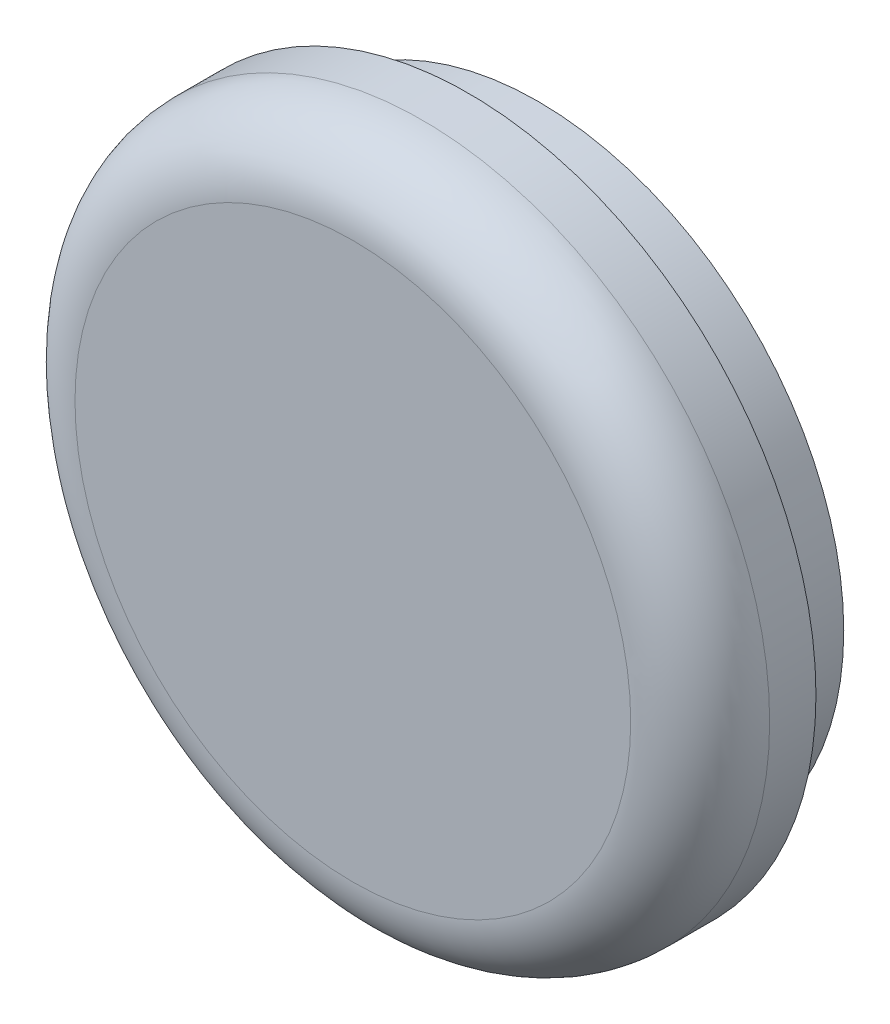
ISO-10303-21;
HEADER;
FILE_DESCRIPTION(('STEP AP214'),'2;1');
FILE_NAME('part.step','',(''),(''),'','','');
FILE_SCHEMA(('AUTOMOTIVE_DESIGN { 1 0 10303 214 1 1 1 1 }'));
ENDSEC;
DATA;
#1=APPLICATION_CONTEXT('core data for automotive mechanical design processes');
#2=APPLICATION_PROTOCOL_DEFINITION('international standard','automotive_design',2000,#1);
#3=PRODUCT_CONTEXT('',#1,'mechanical');
#4=PRODUCT('Part','Part','',(#3));
#5=PRODUCT_RELATED_PRODUCT_CATEGORY('part','',(#4));
#6=PRODUCT_DEFINITION_FORMATION('','',#4);
#7=PRODUCT_DEFINITION_CONTEXT('part definition',#1,'design');
#8=PRODUCT_DEFINITION('design','',#6,#7);
#9=PRODUCT_DEFINITION_SHAPE('','',#8);
#10=(LENGTH_UNIT() NAMED_UNIT(*) SI_UNIT(.MILLI.,.METRE.));
#11=(NAMED_UNIT(*) PLANE_ANGLE_UNIT() SI_UNIT($,.RADIAN.));
#12=(NAMED_UNIT(*) SI_UNIT($,.STERADIAN.) SOLID_ANGLE_UNIT());
#13=UNCERTAINTY_MEASURE_WITH_UNIT(LENGTH_MEASURE(1.E-05),#10,'distance_accuracy_value','');
#14=(GEOMETRIC_REPRESENTATION_CONTEXT(3) GLOBAL_UNCERTAINTY_ASSIGNED_CONTEXT((#13)) GLOBAL_UNIT_ASSIGNED_CONTEXT((#10,
#11,#12)) REPRESENTATION_CONTEXT('',''));
#15=CARTESIAN_POINT('',(0.,0.,0.));
#16=DIRECTION('',(0.,0.,1.));
#17=DIRECTION('',(1.,0.,0.));
#18=AXIS2_PLACEMENT_3D('',#15,#16,#17);
#19=CARTESIAN_POINT('',(0.,0.,3.5));
#20=DIRECTION('',(0.,0.,-1.));
#21=DIRECTION('',(-1.,0.,0.));
#22=AXIS2_PLACEMENT_3D('',#19,#20,#21);
#23=PLANE('',#22);
#24=CARTESIAN_POINT('',(0.,0.,3.5));
#25=DIRECTION('',(0.,0.,-1.));
#26=DIRECTION('',(-1.,0.,0.));
#27=AXIS2_PLACEMENT_3D('',#24,#25,#26);
#28=CIRCLE('',#27,9.);
#29=CARTESIAN_POINT('',(-9.,0.,3.5));
#30=VERTEX_POINT('',#29);
#31=EDGE_CURVE('E51',#30,#30,#28,.T.);
#32=ORIENTED_EDGE('',*,*,#31,.T.);
#33=EDGE_LOOP('',(#32));
#34=FACE_BOUND('',#33,.T.);
#35=ADVANCED_FACE('F39',(#34),#23,.T.);
#36=CARTESIAN_POINT('',(0.,0.,0.5));
#37=DIRECTION('',(0.,0.,-1.));
#38=DIRECTION('',(-1.,0.,0.));
#39=AXIS2_PLACEMENT_3D('',#36,#37,#38);
#40=TOROIDAL_SURFACE('',#39,9.,3.);
#41=CARTESIAN_POINT('',(0.,0.,0.5));
#42=DIRECTION('',(0.,0.,-1.));
#43=DIRECTION('',(-1.,0.,0.));
#44=AXIS2_PLACEMENT_3D('',#41,#42,#43);
#45=CIRCLE('',#44,12.);
#46=CARTESIAN_POINT('',(-12.,0.,0.5));
#47=VERTEX_POINT('',#46);
#48=EDGE_CURVE('E43',#47,#47,#45,.F.);
#49=ORIENTED_EDGE('',*,*,#48,.F.);
#50=EDGE_LOOP('',(#49));
#51=FACE_BOUND('',#50,.T.);
#52=ORIENTED_EDGE('',*,*,#31,.F.);
#53=EDGE_LOOP('',(#52));
#54=FACE_BOUND('',#53,.T.);
#55=ADVANCED_FACE('F41',(#51,#54),#40,.F.);
#56=CARTESIAN_POINT('',(0.,0.,3.5));
#57=DIRECTION('',(0.,0.,-1.));
#58=DIRECTION('',(-1.,0.,0.));
#59=AXIS2_PLACEMENT_3D('',#56,#57,#58);
#60=CYLINDRICAL_SURFACE('',#59,12.);
#61=ORIENTED_EDGE('',*,*,#48,.T.);
#62=EDGE_LOOP('',(#61));
#63=FACE_BOUND('',#62,.T.);
#64=CARTESIAN_POINT('',(0.,0.,-3.));
#65=DIRECTION('',(0.,0.,-1.));
#66=DIRECTION('',(-1.,0.,0.));
#67=AXIS2_PLACEMENT_3D('',#64,#65,#66);
#68=CIRCLE('',#67,12.);
#69=CARTESIAN_POINT('',(-12.,0.,-3.));
#70=VERTEX_POINT('',#69);
#71=EDGE_CURVE('E83',#70,#70,#68,.T.);
#72=ORIENTED_EDGE('',*,*,#71,.T.);
#73=EDGE_LOOP('',(#72));
#74=FACE_BOUND('',#73,.T.);
#75=ADVANCED_FACE('F70',(#63,#74),#60,.F.);
#76=CARTESIAN_POINT('',(0.,0.,5.));
#77=DIRECTION('',(0.,0.,-1.));
#78=DIRECTION('',(-1.,0.,0.));
#79=AXIS2_PLACEMENT_3D('',#76,#77,#78);
#80=CYLINDRICAL_SURFACE('',#79,15.);
#81=CARTESIAN_POINT('',(0.,0.,2.));
#82=DIRECTION('',(0.,0.,1.));
#83=DIRECTION('',(1.,0.,0.));
#84=AXIS2_PLACEMENT_3D('',#81,#82,#83);
#85=CIRCLE('',#84,15.);
#86=CARTESIAN_POINT('',(15.,0.,2.));
#87=VERTEX_POINT('',#86);
#88=EDGE_CURVE('E61',#87,#87,#85,.F.);
#89=ORIENTED_EDGE('',*,*,#88,.T.);
#90=EDGE_LOOP('',(#89));
#91=FACE_BOUND('',#90,.T.);
#92=CARTESIAN_POINT('',(0.,0.,0.));
#93=DIRECTION('',(0.,0.,1.));
#94=DIRECTION('',(1.,0.,0.));
#95=AXIS2_PLACEMENT_3D('',#92,#93,#94);
#96=CIRCLE('',#95,15.);
#97=CARTESIAN_POINT('',(15.,0.,0.));
#98=VERTEX_POINT('',#97);
#99=EDGE_CURVE('E57',#98,#98,#96,.T.);
#100=ORIENTED_EDGE('',*,*,#99,.T.);
#101=EDGE_LOOP('',(#100));
#102=FACE_BOUND('',#101,.T.);
#103=ADVANCED_FACE('F77',(#91,#102),#80,.T.);
#104=CARTESIAN_POINT('',(0.,0.,5.));
#105=DIRECTION('',(0.,0.,1.));
#106=DIRECTION('',(1.,0.,0.));
#107=AXIS2_PLACEMENT_3D('',#104,#105,#106);
#108=PLANE('',#107);
#109=CARTESIAN_POINT('',(0.,0.,5.));
#110=DIRECTION('',(0.,0.,1.));
#111=DIRECTION('',(1.,0.,0.));
#112=AXIS2_PLACEMENT_3D('',#109,#110,#111);
#113=CIRCLE('',#112,12.);
#114=CARTESIAN_POINT('',(12.,0.,5.));
#115=VERTEX_POINT('',#114);
#116=EDGE_CURVE('E56',#115,#115,#113,.T.);
#117=ORIENTED_EDGE('',*,*,#116,.T.);
#118=EDGE_LOOP('',(#117));
#119=FACE_BOUND('',#118,.T.);
#120=ADVANCED_FACE('F99',(#119),#108,.T.);
#121=CARTESIAN_POINT('',(0.,0.,0.));
#122=DIRECTION('',(0.,0.,1.));
#123=DIRECTION('',(1.,0.,0.));
#124=AXIS2_PLACEMENT_3D('',#121,#122,#123);
#125=PLANE('',#124);
#126=CARTESIAN_POINT('',(0.,0.,0.));
#127=DIRECTION('',(0.,0.,-1.));
#128=DIRECTION('',(-1.,0.,0.));
#129=AXIS2_PLACEMENT_3D('',#126,#127,#128);
#130=CIRCLE('',#129,13.2);
#131=CARTESIAN_POINT('',(-13.2,0.,0.));
#132=VERTEX_POINT('',#131);
#133=EDGE_CURVE('E10',#132,#132,#130,.T.);
#134=ORIENTED_EDGE('',*,*,#133,.F.);
#135=EDGE_LOOP('',(#134));
#136=FACE_BOUND('',#135,.T.);
#137=ORIENTED_EDGE('',*,*,#99,.F.);
#138=EDGE_LOOP('',(#137));
#139=FACE_BOUND('',#138,.T.);
#140=ADVANCED_FACE('F101',(#136,#139),#125,.F.);
#141=CARTESIAN_POINT('',(0.,0.,2.));
#142=DIRECTION('',(0.,0.,1.));
#143=DIRECTION('',(1.,0.,0.));
#144=AXIS2_PLACEMENT_3D('',#141,#142,#143);
#145=TOROIDAL_SURFACE('',#144,12.,3.);
#146=ORIENTED_EDGE('',*,*,#88,.F.);
#147=EDGE_LOOP('',(#146));
#148=FACE_BOUND('',#147,.T.);
#149=ORIENTED_EDGE('',*,*,#116,.F.);
#150=EDGE_LOOP('',(#149));
#151=FACE_BOUND('',#150,.T.);
#152=ADVANCED_FACE('F97',(#148,#151),#145,.T.);
#153=CARTESIAN_POINT('',(0.,0.,-3.));
#154=DIRECTION('',(0.,0.,-1.));
#155=DIRECTION('',(-1.,0.,0.));
#156=AXIS2_PLACEMENT_3D('',#153,#154,#155);
#157=PLANE('',#156);
#158=ORIENTED_EDGE('',*,*,#71,.F.);
#159=EDGE_LOOP('',(#158));
#160=FACE_BOUND('',#159,.T.);
#161=CARTESIAN_POINT('',(0.,0.,-3.));
#162=DIRECTION('',(0.,0.,-1.));
#163=DIRECTION('',(-1.,0.,0.));
#164=AXIS2_PLACEMENT_3D('',#161,#162,#163);
#165=CIRCLE('',#164,13.2);
#166=CARTESIAN_POINT('',(-13.2,0.,-3.));
#167=VERTEX_POINT('',#166);
#168=EDGE_CURVE('E53',#167,#167,#165,.T.);
#169=ORIENTED_EDGE('',*,*,#168,.T.);
#170=EDGE_LOOP('',(#169));
#171=FACE_BOUND('',#170,.T.);
#172=ADVANCED_FACE('F90',(#160,#171),#157,.T.);
#173=CARTESIAN_POINT('',(0.,0.,-3.));
#174=DIRECTION('',(0.,0.,1.));
#175=DIRECTION('',(1.,0.,0.));
#176=AXIS2_PLACEMENT_3D('',#173,#174,#175);
#177=CYLINDRICAL_SURFACE('',#176,13.2);
#178=ORIENTED_EDGE('',*,*,#168,.F.);
#179=EDGE_LOOP('',(#178));
#180=FACE_BOUND('',#179,.T.);
#181=ORIENTED_EDGE('',*,*,#133,.T.);
#182=EDGE_LOOP('',(#181));
#183=FACE_BOUND('',#182,.T.);
#184=ADVANCED_FACE('F92',(#180,#183),#177,.T.);
#185=CLOSED_SHELL('',(#35,#55,#75,#103,#120,#140,#152,#172,#184));
#186=MANIFOLD_SOLID_BREP('B2',#185);
#187=ADVANCED_BREP_SHAPE_REPRESENTATION('',(#18,#186),#14);
#188=SHAPE_DEFINITION_REPRESENTATION(#9,#187);
ENDSEC;
END-ISO-10303-21;
